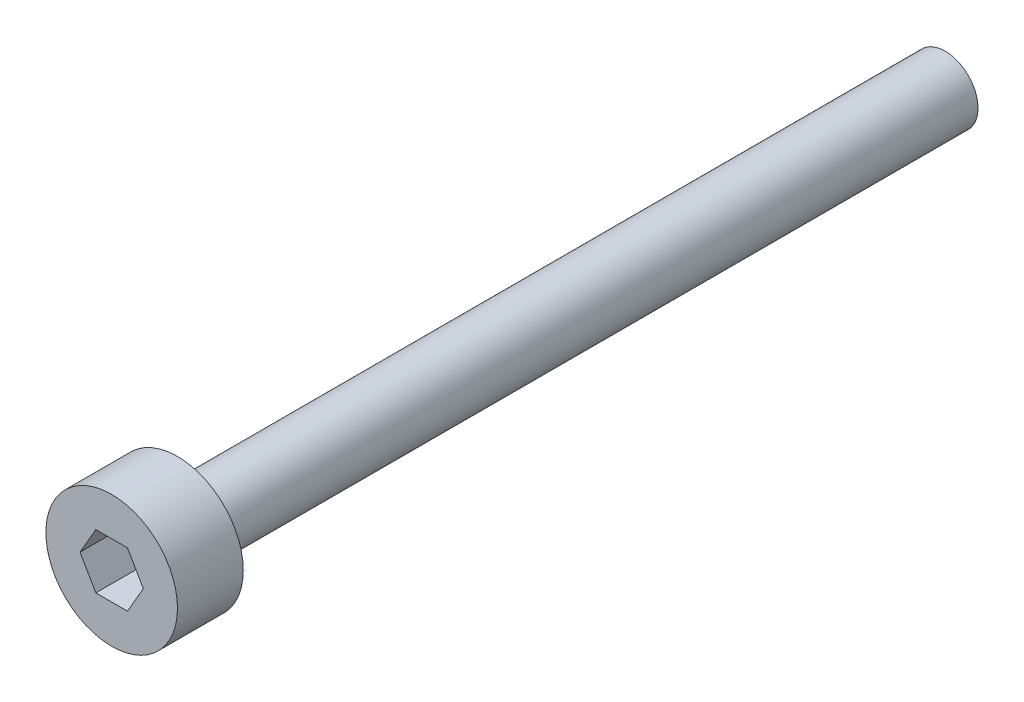
ISO-10303-21;
HEADER;
FILE_DESCRIPTION(('STEP AP214'),'2;1');
FILE_NAME('part.step','',(''),(''),'','','');
FILE_SCHEMA(('AUTOMOTIVE_DESIGN { 1 0 10303 214 1 1 1 1 }'));
ENDSEC;
DATA;
#1=APPLICATION_CONTEXT('core data for automotive mechanical design processes');
#2=APPLICATION_PROTOCOL_DEFINITION('international standard','automotive_design',2000,#1);
#3=PRODUCT_CONTEXT('',#1,'mechanical');
#4=PRODUCT('Part','Part','',(#3));
#5=PRODUCT_RELATED_PRODUCT_CATEGORY('part','',(#4));
#6=PRODUCT_DEFINITION_FORMATION('','',#4);
#7=PRODUCT_DEFINITION_CONTEXT('part definition',#1,'design');
#8=PRODUCT_DEFINITION('design','',#6,#7);
#9=PRODUCT_DEFINITION_SHAPE('','',#8);
#10=(LENGTH_UNIT() NAMED_UNIT(*) SI_UNIT(.MILLI.,.METRE.));
#11=(NAMED_UNIT(*) PLANE_ANGLE_UNIT() SI_UNIT($,.RADIAN.));
#12=(NAMED_UNIT(*) SI_UNIT($,.STERADIAN.) SOLID_ANGLE_UNIT());
#13=UNCERTAINTY_MEASURE_WITH_UNIT(LENGTH_MEASURE(1.E-05),#10,'distance_accuracy_value','');
#14=(GEOMETRIC_REPRESENTATION_CONTEXT(3) GLOBAL_UNCERTAINTY_ASSIGNED_CONTEXT((#13)) GLOBAL_UNIT_ASSIGNED_CONTEXT((#10,
#11,#12)) REPRESENTATION_CONTEXT('',''));
#15=CARTESIAN_POINT('',(0.,0.,0.));
#16=DIRECTION('',(0.,0.,1.));
#17=DIRECTION('',(1.,0.,0.));
#18=AXIS2_PLACEMENT_3D('',#15,#16,#17);
#19=CARTESIAN_POINT('',(0.,0.,3.));
#20=DIRECTION('',(0.,0.,-1.));
#21=DIRECTION('',(-1.,0.,0.));
#22=AXIS2_PLACEMENT_3D('',#19,#20,#21);
#23=CYLINDRICAL_SURFACE('',#22,3.);
#24=CARTESIAN_POINT('',(0.,0.,3.));
#25=DIRECTION('',(0.,0.,1.));
#26=DIRECTION('',(1.,0.,0.));
#27=AXIS2_PLACEMENT_3D('',#24,#25,#26);
#28=CIRCLE('',#27,3.);
#29=CARTESIAN_POINT('',(3.,0.,3.));
#30=VERTEX_POINT('',#29);
#31=EDGE_CURVE('E54',#30,#30,#28,.T.);
#32=ORIENTED_EDGE('',*,*,#31,.F.);
#33=EDGE_LOOP('',(#32));
#34=FACE_BOUND('',#33,.T.);
#35=CARTESIAN_POINT('',(0.,0.,0.));
#36=DIRECTION('',(0.,0.,1.));
#37=DIRECTION('',(1.,0.,0.));
#38=AXIS2_PLACEMENT_3D('',#35,#36,#37);
#39=CIRCLE('',#38,3.);
#40=CARTESIAN_POINT('',(3.,0.,0.));
#41=VERTEX_POINT('',#40);
#42=EDGE_CURVE('E48',#41,#41,#39,.T.);
#43=ORIENTED_EDGE('',*,*,#42,.T.);
#44=EDGE_LOOP('',(#43));
#45=FACE_BOUND('',#44,.T.);
#46=ADVANCED_FACE('F45',(#34,#45),#23,.T.);
#47=CARTESIAN_POINT('',(0.,0.,3.));
#48=DIRECTION('',(0.,0.,1.));
#49=DIRECTION('',(1.,0.,0.));
#50=AXIS2_PLACEMENT_3D('',#47,#48,#49);
#51=PLANE('',#50);
#52=DIRECTION('',(0.5,0.866025403784439,0.));
#53=VECTOR('',#52,1.);
#54=CARTESIAN_POINT('',(0.721687836487033,-1.25,3.));
#55=LINE('',#54,#53);
#56=CARTESIAN_POINT('',(0.721687836487033,-1.25,3.));
#57=VERTEX_POINT('',#56);
#58=CARTESIAN_POINT('',(1.44337567297407,0.,3.));
#59=VERTEX_POINT('',#58);
#60=EDGE_CURVE('E62',#57,#59,#55,.T.);
#61=ORIENTED_EDGE('',*,*,#60,.F.);
#62=DIRECTION('',(1.,0.,0.));
#63=VECTOR('',#62,1.);
#64=CARTESIAN_POINT('',(-0.721687836487031,-1.25,3.));
#65=LINE('',#64,#63);
#66=CARTESIAN_POINT('',(-0.721687836487031,-1.25,3.));
#67=VERTEX_POINT('',#66);
#68=EDGE_CURVE('E156',#67,#57,#65,.T.);
#69=ORIENTED_EDGE('',*,*,#68,.F.);
#70=DIRECTION('',(0.5,-0.866025403784438,0.));
#71=VECTOR('',#70,1.);
#72=CARTESIAN_POINT('',(-1.44337567297406,0.,3.));
#73=LINE('',#72,#71);
#74=CARTESIAN_POINT('',(-1.44337567297406,0.,3.));
#75=VERTEX_POINT('',#74);
#76=EDGE_CURVE('E153',#75,#67,#73,.T.);
#77=ORIENTED_EDGE('',*,*,#76,.F.);
#78=DIRECTION('',(-0.5,-0.866025403784439,0.));
#79=VECTOR('',#78,1.);
#80=CARTESIAN_POINT('',(-0.721687836487032,1.25,3.));
#81=LINE('',#80,#79);
#82=CARTESIAN_POINT('',(-0.721687836487032,1.25,3.));
#83=VERTEX_POINT('',#82);
#84=EDGE_CURVE('E110',#83,#75,#81,.T.);
#85=ORIENTED_EDGE('',*,*,#84,.F.);
#86=DIRECTION('',(-1.,0.,0.));
#87=VECTOR('',#86,1.);
#88=CARTESIAN_POINT('',(0.721687836487032,1.25,3.));
#89=LINE('',#88,#87);
#90=CARTESIAN_POINT('',(0.721687836487032,1.25,3.));
#91=VERTEX_POINT('',#90);
#92=EDGE_CURVE('E147',#91,#83,#89,.T.);
#93=ORIENTED_EDGE('',*,*,#92,.F.);
#94=DIRECTION('',(-0.5,0.866025403784438,0.));
#95=VECTOR('',#94,1.);
#96=CARTESIAN_POINT('',(1.44337567297406,0.,3.));
#97=LINE('',#96,#95);
#98=EDGE_CURVE('E142',#59,#91,#97,.T.);
#99=ORIENTED_EDGE('',*,*,#98,.F.);
#100=EDGE_LOOP('',(#61,#69,#77,#85,#93,#99));
#101=FACE_BOUND('',#100,.T.);
#102=ORIENTED_EDGE('',*,*,#31,.T.);
#103=EDGE_LOOP('',(#102));
#104=FACE_BOUND('',#103,.T.);
#105=ADVANCED_FACE('F182',(#101,#104),#51,.T.);
#106=CARTESIAN_POINT('',(0.,0.,0.));
#107=DIRECTION('',(0.,0.,1.));
#108=DIRECTION('',(1.,0.,0.));
#109=AXIS2_PLACEMENT_3D('',#106,#107,#108);
#110=PLANE('',#109);
#111=CARTESIAN_POINT('',(0.,0.,0.));
#112=DIRECTION('',(0.,0.,-1.));
#113=DIRECTION('',(-1.,0.,0.));
#114=AXIS2_PLACEMENT_3D('',#111,#112,#113);
#115=CIRCLE('',#114,1.5);
#116=CARTESIAN_POINT('',(-1.5,0.,0.));
#117=VERTEX_POINT('',#116);
#118=EDGE_CURVE('E11',#117,#117,#115,.T.);
#119=ORIENTED_EDGE('',*,*,#118,.F.);
#120=EDGE_LOOP('',(#119));
#121=FACE_BOUND('',#120,.T.);
#122=ORIENTED_EDGE('',*,*,#42,.F.);
#123=EDGE_LOOP('',(#122));
#124=FACE_BOUND('',#123,.T.);
#125=ADVANCED_FACE('F179',(#121,#124),#110,.F.);
#126=CARTESIAN_POINT('',(0.721687836487033,-1.25,1.));
#127=DIRECTION('',(0.866025403784439,-0.5,0.));
#128=DIRECTION('',(0.5,0.866025403784439,0.));
#129=AXIS2_PLACEMENT_3D('',#126,#127,#128);
#130=PLANE('',#129);
#131=ORIENTED_EDGE('',*,*,#60,.T.);
#132=DIRECTION('',(0.,0.,1.));
#133=VECTOR('',#132,1.);
#134=CARTESIAN_POINT('',(1.44337567297406,0.,1.));
#135=LINE('',#134,#133);
#136=CARTESIAN_POINT('',(1.44337567297406,0.,1.));
#137=VERTEX_POINT('',#136);
#138=EDGE_CURVE('E92',#137,#59,#135,.T.);
#139=ORIENTED_EDGE('',*,*,#138,.F.);
#140=DIRECTION('',(0.5,0.866025403784439,0.));
#141=VECTOR('',#140,1.);
#142=CARTESIAN_POINT('',(0.721687836487033,-1.25,1.));
#143=LINE('',#142,#141);
#144=CARTESIAN_POINT('',(0.721687836487033,-1.25,1.));
#145=VERTEX_POINT('',#144);
#146=EDGE_CURVE('E159',#145,#137,#143,.T.);
#147=ORIENTED_EDGE('',*,*,#146,.F.);
#148=DIRECTION('',(0.,0.,1.));
#149=VECTOR('',#148,1.);
#150=CARTESIAN_POINT('',(0.721687836487033,-1.25,1.));
#151=LINE('',#150,#149);
#152=EDGE_CURVE('E70',#145,#57,#151,.T.);
#153=ORIENTED_EDGE('',*,*,#152,.T.);
#154=EDGE_LOOP('',(#131,#139,#147,#153));
#155=FACE_BOUND('',#154,.T.);
#156=ADVANCED_FACE('F181',(#155),#130,.F.);
#157=CARTESIAN_POINT('',(-0.721687836487031,-1.25,1.));
#158=DIRECTION('',(0.,-1.,0.));
#159=DIRECTION('',(0.,0.,-1.));
#160=AXIS2_PLACEMENT_3D('',#157,#158,#159);
#161=PLANE('',#160);
#162=ORIENTED_EDGE('',*,*,#68,.T.);
#163=ORIENTED_EDGE('',*,*,#152,.F.);
#164=DIRECTION('',(1.,0.,0.));
#165=VECTOR('',#164,1.);
#166=CARTESIAN_POINT('',(-0.721687836487031,-1.25,1.));
#167=LINE('',#166,#165);
#168=CARTESIAN_POINT('',(-0.721687836487031,-1.25,1.));
#169=VERTEX_POINT('',#168);
#170=EDGE_CURVE('E124',#169,#145,#167,.T.);
#171=ORIENTED_EDGE('',*,*,#170,.F.);
#172=DIRECTION('',(0.,0.,1.));
#173=VECTOR('',#172,1.);
#174=CARTESIAN_POINT('',(-0.721687836487031,-1.25,1.));
#175=LINE('',#174,#173);
#176=EDGE_CURVE('E115',#169,#67,#175,.T.);
#177=ORIENTED_EDGE('',*,*,#176,.T.);
#178=EDGE_LOOP('',(#162,#163,#171,#177));
#179=FACE_BOUND('',#178,.T.);
#180=ADVANCED_FACE('F189',(#179),#161,.F.);
#181=CARTESIAN_POINT('',(-1.44337567297406,0.,1.));
#182=DIRECTION('',(-0.866025403784438,-0.5,0.));
#183=DIRECTION('',(0.5,-0.866025403784438,0.));
#184=AXIS2_PLACEMENT_3D('',#181,#182,#183);
#185=PLANE('',#184);
#186=ORIENTED_EDGE('',*,*,#76,.T.);
#187=ORIENTED_EDGE('',*,*,#176,.F.);
#188=DIRECTION('',(0.5,-0.866025403784438,0.));
#189=VECTOR('',#188,1.);
#190=CARTESIAN_POINT('',(-1.44337567297406,0.,1.));
#191=LINE('',#190,#189);
#192=CARTESIAN_POINT('',(-1.44337567297406,0.,1.));
#193=VERTEX_POINT('',#192);
#194=EDGE_CURVE('E119',#193,#169,#191,.T.);
#195=ORIENTED_EDGE('',*,*,#194,.F.);
#196=DIRECTION('',(0.,0.,1.));
#197=VECTOR('',#196,1.);
#198=CARTESIAN_POINT('',(-1.44337567297406,0.,1.));
#199=LINE('',#198,#197);
#200=EDGE_CURVE('E103',#193,#75,#199,.T.);
#201=ORIENTED_EDGE('',*,*,#200,.T.);
#202=EDGE_LOOP('',(#186,#187,#195,#201));
#203=FACE_BOUND('',#202,.T.);
#204=ADVANCED_FACE('F120',(#203),#185,.F.);
#205=CARTESIAN_POINT('',(-0.721687836487032,1.25,1.));
#206=DIRECTION('',(-0.866025403784439,0.5,0.));
#207=DIRECTION('',(-0.5,-0.866025403784439,0.));
#208=AXIS2_PLACEMENT_3D('',#205,#206,#207);
#209=PLANE('',#208);
#210=ORIENTED_EDGE('',*,*,#84,.T.);
#211=ORIENTED_EDGE('',*,*,#200,.F.);
#212=DIRECTION('',(-0.5,-0.866025403784439,0.));
#213=VECTOR('',#212,1.);
#214=CARTESIAN_POINT('',(-0.721687836487032,1.25,1.));
#215=LINE('',#214,#213);
#216=CARTESIAN_POINT('',(-0.721687836487032,1.25,1.));
#217=VERTEX_POINT('',#216);
#218=EDGE_CURVE('E107',#217,#193,#215,.T.);
#219=ORIENTED_EDGE('',*,*,#218,.F.);
#220=DIRECTION('',(0.,0.,1.));
#221=VECTOR('',#220,1.);
#222=CARTESIAN_POINT('',(-0.721687836487032,1.25,1.));
#223=LINE('',#222,#221);
#224=EDGE_CURVE('E116',#217,#83,#223,.T.);
#225=ORIENTED_EDGE('',*,*,#224,.T.);
#226=EDGE_LOOP('',(#210,#211,#219,#225));
#227=FACE_BOUND('',#226,.T.);
#228=ADVANCED_FACE('F105',(#227),#209,.F.);
#229=CARTESIAN_POINT('',(0.721687836487032,1.25,1.));
#230=DIRECTION('',(0.,1.,0.));
#231=DIRECTION('',(0.,0.,1.));
#232=AXIS2_PLACEMENT_3D('',#229,#230,#231);
#233=PLANE('',#232);
#234=ORIENTED_EDGE('',*,*,#92,.T.);
#235=ORIENTED_EDGE('',*,*,#224,.F.);
#236=DIRECTION('',(-1.,0.,0.));
#237=VECTOR('',#236,1.);
#238=CARTESIAN_POINT('',(0.721687836487032,1.25,1.));
#239=LINE('',#238,#237);
#240=CARTESIAN_POINT('',(0.721687836487032,1.25,1.));
#241=VERTEX_POINT('',#240);
#242=EDGE_CURVE('E130',#241,#217,#239,.T.);
#243=ORIENTED_EDGE('',*,*,#242,.F.);
#244=DIRECTION('',(0.,0.,1.));
#245=VECTOR('',#244,1.);
#246=CARTESIAN_POINT('',(0.721687836487032,1.25,1.));
#247=LINE('',#246,#245);
#248=EDGE_CURVE('E166',#241,#91,#247,.T.);
#249=ORIENTED_EDGE('',*,*,#248,.T.);
#250=EDGE_LOOP('',(#234,#235,#243,#249));
#251=FACE_BOUND('',#250,.T.);
#252=ADVANCED_FACE('F230',(#251),#233,.F.);
#253=CARTESIAN_POINT('',(1.44337567297406,0.,1.));
#254=DIRECTION('',(0.866025403784438,0.5,0.));
#255=DIRECTION('',(-0.5,0.866025403784438,0.));
#256=AXIS2_PLACEMENT_3D('',#253,#254,#255);
#257=PLANE('',#256);
#258=ORIENTED_EDGE('',*,*,#98,.T.);
#259=ORIENTED_EDGE('',*,*,#248,.F.);
#260=DIRECTION('',(-0.5,0.866025403784438,0.));
#261=VECTOR('',#260,1.);
#262=CARTESIAN_POINT('',(1.44337567297406,0.,1.));
#263=LINE('',#262,#261);
#264=EDGE_CURVE('E134',#137,#241,#263,.T.);
#265=ORIENTED_EDGE('',*,*,#264,.F.);
#266=ORIENTED_EDGE('',*,*,#138,.T.);
#267=EDGE_LOOP('',(#258,#259,#265,#266));
#268=FACE_BOUND('',#267,.T.);
#269=ADVANCED_FACE('F238',(#268),#257,.F.);
#270=CARTESIAN_POINT('',(0.,0.,1.));
#271=DIRECTION('',(0.,0.,1.));
#272=DIRECTION('',(1.,0.,0.));
#273=AXIS2_PLACEMENT_3D('',#270,#271,#272);
#274=PLANE('',#273);
#275=ORIENTED_EDGE('',*,*,#146,.T.);
#276=ORIENTED_EDGE('',*,*,#264,.T.);
#277=ORIENTED_EDGE('',*,*,#242,.T.);
#278=ORIENTED_EDGE('',*,*,#218,.T.);
#279=ORIENTED_EDGE('',*,*,#194,.T.);
#280=ORIENTED_EDGE('',*,*,#170,.T.);
#281=EDGE_LOOP('',(#275,#276,#277,#278,#279,#280));
#282=FACE_BOUND('',#281,.T.);
#283=ADVANCED_FACE('F127',(#282),#274,.T.);
#284=CARTESIAN_POINT('',(0.,0.,-35.));
#285=DIRECTION('',(0.,0.,1.));
#286=DIRECTION('',(1.,0.,0.));
#287=AXIS2_PLACEMENT_3D('',#284,#285,#286);
#288=CYLINDRICAL_SURFACE('',#287,1.5);
#289=CARTESIAN_POINT('',(0.,0.,-35.));
#290=DIRECTION('',(0.,0.,-1.));
#291=DIRECTION('',(-1.,0.,0.));
#292=AXIS2_PLACEMENT_3D('',#289,#290,#291);
#293=CIRCLE('',#292,1.5);
#294=CARTESIAN_POINT('',(-1.5,0.,-35.));
#295=VERTEX_POINT('',#294);
#296=EDGE_CURVE('E143',#295,#295,#293,.T.);
#297=ORIENTED_EDGE('',*,*,#296,.F.);
#298=EDGE_LOOP('',(#297));
#299=FACE_BOUND('',#298,.T.);
#300=ORIENTED_EDGE('',*,*,#118,.T.);
#301=EDGE_LOOP('',(#300));
#302=FACE_BOUND('',#301,.T.);
#303=ADVANCED_FACE('F253',(#299,#302),#288,.T.);
#304=CARTESIAN_POINT('',(0.,0.,-35.));
#305=DIRECTION('',(0.,0.,-1.));
#306=DIRECTION('',(-1.,0.,0.));
#307=AXIS2_PLACEMENT_3D('',#304,#305,#306);
#308=PLANE('',#307);
#309=ORIENTED_EDGE('',*,*,#296,.T.);
#310=EDGE_LOOP('',(#309));
#311=FACE_BOUND('',#310,.T.);
#312=ADVANCED_FACE('F264',(#311),#308,.T.);
#313=CLOSED_SHELL('',(#46,#105,#125,#156,#180,#204,#228,#252,#269,#283,#303,#312));
#314=MANIFOLD_SOLID_BREP('B2',#313);
#315=ADVANCED_BREP_SHAPE_REPRESENTATION('',(#18,#314),#14);
#316=SHAPE_DEFINITION_REPRESENTATION(#9,#315);
ENDSEC;
END-ISO-10303-21;
